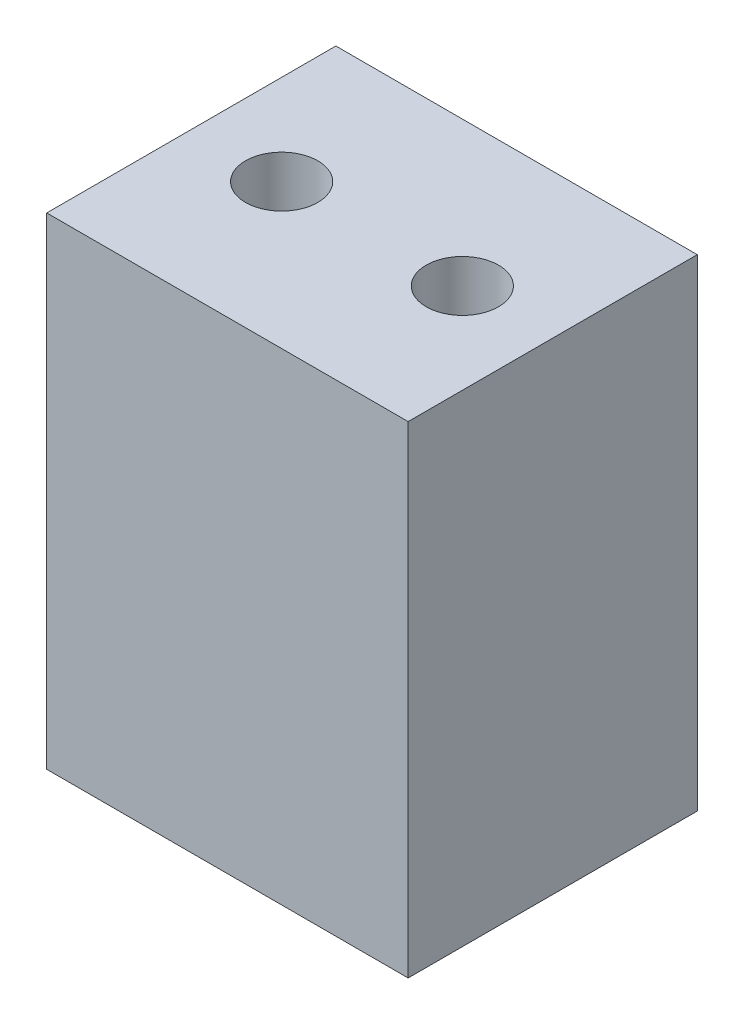
ISO-10303-21;
HEADER;
FILE_DESCRIPTION(('STEP AP214'),'2;1');
FILE_NAME('part.step','',(''),(''),'','','');
FILE_SCHEMA(('AUTOMOTIVE_DESIGN { 1 0 10303 214 1 1 1 1 }'));
ENDSEC;
DATA;
#1=APPLICATION_CONTEXT('core data for automotive mechanical design processes');
#2=APPLICATION_PROTOCOL_DEFINITION('international standard','automotive_design',2000,#1);
#3=PRODUCT_CONTEXT('',#1,'mechanical');
#4=PRODUCT('Part','Part','',(#3));
#5=PRODUCT_RELATED_PRODUCT_CATEGORY('part','',(#4));
#6=PRODUCT_DEFINITION_FORMATION('','',#4);
#7=PRODUCT_DEFINITION_CONTEXT('part definition',#1,'design');
#8=PRODUCT_DEFINITION('design','',#6,#7);
#9=PRODUCT_DEFINITION_SHAPE('','',#8);
#10=(LENGTH_UNIT() NAMED_UNIT(*) SI_UNIT(.MILLI.,.METRE.));
#11=(NAMED_UNIT(*) PLANE_ANGLE_UNIT() SI_UNIT($,.RADIAN.));
#12=(NAMED_UNIT(*) SI_UNIT($,.STERADIAN.) SOLID_ANGLE_UNIT());
#13=UNCERTAINTY_MEASURE_WITH_UNIT(LENGTH_MEASURE(1.E-05),#10,'distance_accuracy_value','');
#14=(GEOMETRIC_REPRESENTATION_CONTEXT(3) GLOBAL_UNCERTAINTY_ASSIGNED_CONTEXT((#13)) GLOBAL_UNIT_ASSIGNED_CONTEXT((#10,
#11,#12)) REPRESENTATION_CONTEXT('',''));
#15=CARTESIAN_POINT('',(0.,0.,0.));
#16=DIRECTION('',(0.,0.,1.));
#17=DIRECTION('',(1.,0.,0.));
#18=AXIS2_PLACEMENT_3D('',#15,#16,#17);
#19=CARTESIAN_POINT('',(0.,40.,0.));
#20=DIRECTION('',(1.,0.,0.));
#21=DIRECTION('',(0.,0.,-1.));
#22=AXIS2_PLACEMENT_3D('',#19,#20,#21);
#23=PLANE('',#22);
#24=DIRECTION('',(0.,0.,1.));
#25=VECTOR('',#24,1.);
#26=CARTESIAN_POINT('',(0.,0.,0.));
#27=LINE('',#26,#25);
#28=CARTESIAN_POINT('',(0.,0.,-24.));
#29=VERTEX_POINT('',#28);
#30=CARTESIAN_POINT('',(0.,0.,0.));
#31=VERTEX_POINT('',#30);
#32=EDGE_CURVE('E96',#29,#31,#27,.T.);
#33=ORIENTED_EDGE('',*,*,#32,.T.);
#34=DIRECTION('',(0.,-1.,0.));
#35=VECTOR('',#34,1.);
#36=CARTESIAN_POINT('',(0.,40.,0.));
#37=LINE('',#36,#35);
#38=CARTESIAN_POINT('',(0.,40.,0.));
#39=VERTEX_POINT('',#38);
#40=EDGE_CURVE('E11',#39,#31,#37,.T.);
#41=ORIENTED_EDGE('',*,*,#40,.F.);
#42=DIRECTION('',(0.,0.,1.));
#43=VECTOR('',#42,1.);
#44=CARTESIAN_POINT('',(0.,40.,0.));
#45=LINE('',#44,#43);
#46=CARTESIAN_POINT('',(0.,40.,-24.));
#47=VERTEX_POINT('',#46);
#48=EDGE_CURVE('E84',#47,#39,#45,.T.);
#49=ORIENTED_EDGE('',*,*,#48,.F.);
#50=DIRECTION('',(0.,-1.,0.));
#51=VECTOR('',#50,1.);
#52=CARTESIAN_POINT('',(0.,40.,-24.));
#53=LINE('',#52,#51);
#54=EDGE_CURVE('E92',#47,#29,#53,.T.);
#55=ORIENTED_EDGE('',*,*,#54,.T.);
#56=EDGE_LOOP('',(#33,#41,#49,#55));
#57=FACE_BOUND('',#56,.T.);
#58=ADVANCED_FACE('F33',(#57),#23,.F.);
#59=CARTESIAN_POINT('',(0.,40.,0.));
#60=DIRECTION('',(0.,0.,-1.));
#61=DIRECTION('',(-1.,0.,0.));
#62=AXIS2_PLACEMENT_3D('',#59,#60,#61);
#63=PLANE('',#62);
#64=DIRECTION('',(1.,0.,0.));
#65=VECTOR('',#64,1.);
#66=CARTESIAN_POINT('',(0.,0.,0.));
#67=LINE('',#66,#65);
#68=CARTESIAN_POINT('',(30.,0.,0.));
#69=VERTEX_POINT('',#68);
#70=EDGE_CURVE('E88',#31,#69,#67,.T.);
#71=ORIENTED_EDGE('',*,*,#70,.T.);
#72=DIRECTION('',(0.,-1.,0.));
#73=VECTOR('',#72,1.);
#74=CARTESIAN_POINT('',(30.,40.,0.));
#75=LINE('',#74,#73);
#76=CARTESIAN_POINT('',(30.,40.,0.));
#77=VERTEX_POINT('',#76);
#78=EDGE_CURVE('E41',#77,#69,#75,.T.);
#79=ORIENTED_EDGE('',*,*,#78,.F.);
#80=DIRECTION('',(1.,0.,0.));
#81=VECTOR('',#80,1.);
#82=CARTESIAN_POINT('',(0.,40.,0.));
#83=LINE('',#82,#81);
#84=EDGE_CURVE('E79',#39,#77,#83,.T.);
#85=ORIENTED_EDGE('',*,*,#84,.F.);
#86=ORIENTED_EDGE('',*,*,#40,.T.);
#87=EDGE_LOOP('',(#71,#79,#85,#86));
#88=FACE_BOUND('',#87,.T.);
#89=ADVANCED_FACE('F87',(#88),#63,.F.);
#90=CARTESIAN_POINT('',(30.,40.,0.));
#91=DIRECTION('',(-1.,0.,0.));
#92=DIRECTION('',(0.,0.,1.));
#93=AXIS2_PLACEMENT_3D('',#90,#91,#92);
#94=PLANE('',#93);
#95=DIRECTION('',(0.,0.,-1.));
#96=VECTOR('',#95,1.);
#97=CARTESIAN_POINT('',(30.,0.,0.));
#98=LINE('',#97,#96);
#99=CARTESIAN_POINT('',(30.,0.,-24.));
#100=VERTEX_POINT('',#99);
#101=EDGE_CURVE('E66',#69,#100,#98,.T.);
#102=ORIENTED_EDGE('',*,*,#101,.T.);
#103=DIRECTION('',(0.,-1.,0.));
#104=VECTOR('',#103,1.);
#105=CARTESIAN_POINT('',(30.,40.,-24.));
#106=LINE('',#105,#104);
#107=CARTESIAN_POINT('',(30.,40.,-24.));
#108=VERTEX_POINT('',#107);
#109=EDGE_CURVE('E89',#108,#100,#106,.T.);
#110=ORIENTED_EDGE('',*,*,#109,.F.);
#111=DIRECTION('',(0.,0.,-1.));
#112=VECTOR('',#111,1.);
#113=CARTESIAN_POINT('',(30.,40.,0.));
#114=LINE('',#113,#112);
#115=EDGE_CURVE('E82',#77,#108,#114,.T.);
#116=ORIENTED_EDGE('',*,*,#115,.F.);
#117=ORIENTED_EDGE('',*,*,#78,.T.);
#118=EDGE_LOOP('',(#102,#110,#116,#117));
#119=FACE_BOUND('',#118,.T.);
#120=ADVANCED_FACE('F90',(#119),#94,.F.);
#121=CARTESIAN_POINT('',(0.,40.,-24.));
#122=DIRECTION('',(0.,0.,1.));
#123=DIRECTION('',(1.,0.,0.));
#124=AXIS2_PLACEMENT_3D('',#121,#122,#123);
#125=PLANE('',#124);
#126=DIRECTION('',(-1.,0.,0.));
#127=VECTOR('',#126,1.);
#128=CARTESIAN_POINT('',(0.,0.,-24.));
#129=LINE('',#128,#127);
#130=EDGE_CURVE('E72',#100,#29,#129,.T.);
#131=ORIENTED_EDGE('',*,*,#130,.T.);
#132=ORIENTED_EDGE('',*,*,#54,.F.);
#133=DIRECTION('',(-1.,0.,0.));
#134=VECTOR('',#133,1.);
#135=CARTESIAN_POINT('',(0.,40.,-24.));
#136=LINE('',#135,#134);
#137=EDGE_CURVE('E49',#108,#47,#136,.T.);
#138=ORIENTED_EDGE('',*,*,#137,.F.);
#139=ORIENTED_EDGE('',*,*,#109,.T.);
#140=EDGE_LOOP('',(#131,#132,#138,#139));
#141=FACE_BOUND('',#140,.T.);
#142=ADVANCED_FACE('F104',(#141),#125,.F.);
#143=CARTESIAN_POINT('',(0.,40.,0.));
#144=DIRECTION('',(0.,-1.,0.));
#145=DIRECTION('',(0.,0.,-1.));
#146=AXIS2_PLACEMENT_3D('',#143,#144,#145);
#147=PLANE('',#146);
#148=CARTESIAN_POINT('',(7.5,40.,-12.));
#149=DIRECTION('',(0.,1.,0.));
#150=DIRECTION('',(0.,0.,1.));
#151=AXIS2_PLACEMENT_3D('',#148,#149,#150);
#152=CIRCLE('',#151,3.);
#153=CARTESIAN_POINT('',(7.5,40.,-9.));
#154=VERTEX_POINT('',#153);
#155=EDGE_CURVE('E116',#154,#154,#152,.T.);
#156=ORIENTED_EDGE('',*,*,#155,.F.);
#157=EDGE_LOOP('',(#156));
#158=FACE_BOUND('',#157,.T.);
#159=CARTESIAN_POINT('',(22.5,40.,-12.));
#160=DIRECTION('',(0.,1.,0.));
#161=DIRECTION('',(0.,0.,1.));
#162=AXIS2_PLACEMENT_3D('',#159,#160,#161);
#163=CIRCLE('',#162,3.);
#164=CARTESIAN_POINT('',(22.5,40.,-9.));
#165=VERTEX_POINT('',#164);
#166=EDGE_CURVE('E110',#165,#165,#163,.T.);
#167=ORIENTED_EDGE('',*,*,#166,.F.);
#168=EDGE_LOOP('',(#167));
#169=FACE_BOUND('',#168,.T.);
#170=ORIENTED_EDGE('',*,*,#48,.T.);
#171=ORIENTED_EDGE('',*,*,#84,.T.);
#172=ORIENTED_EDGE('',*,*,#115,.T.);
#173=ORIENTED_EDGE('',*,*,#137,.T.);
#174=EDGE_LOOP('',(#170,#171,#172,#173));
#175=FACE_BOUND('',#174,.T.);
#176=ADVANCED_FACE('F80',(#158,#169,#175),#147,.F.);
#177=CARTESIAN_POINT('',(0.,0.,0.));
#178=DIRECTION('',(0.,-1.,0.));
#179=DIRECTION('',(0.,0.,-1.));
#180=AXIS2_PLACEMENT_3D('',#177,#178,#179);
#181=PLANE('',#180);
#182=CARTESIAN_POINT('',(7.5,0.,-12.));
#183=DIRECTION('',(0.,1.,0.));
#184=DIRECTION('',(0.,0.,1.));
#185=AXIS2_PLACEMENT_3D('',#182,#183,#184);
#186=CIRCLE('',#185,3.);
#187=CARTESIAN_POINT('',(7.5,0.,-9.));
#188=VERTEX_POINT('',#187);
#189=EDGE_CURVE('E99',#188,#188,#186,.T.);
#190=ORIENTED_EDGE('',*,*,#189,.T.);
#191=EDGE_LOOP('',(#190));
#192=FACE_BOUND('',#191,.T.);
#193=CARTESIAN_POINT('',(22.5,0.,-12.));
#194=DIRECTION('',(0.,1.,0.));
#195=DIRECTION('',(0.,0.,1.));
#196=AXIS2_PLACEMENT_3D('',#193,#194,#195);
#197=CIRCLE('',#196,3.);
#198=CARTESIAN_POINT('',(22.5,0.,-9.));
#199=VERTEX_POINT('',#198);
#200=EDGE_CURVE('E113',#199,#199,#197,.T.);
#201=ORIENTED_EDGE('',*,*,#200,.T.);
#202=EDGE_LOOP('',(#201));
#203=FACE_BOUND('',#202,.T.);
#204=ORIENTED_EDGE('',*,*,#32,.F.);
#205=ORIENTED_EDGE('',*,*,#130,.F.);
#206=ORIENTED_EDGE('',*,*,#101,.F.);
#207=ORIENTED_EDGE('',*,*,#70,.F.);
#208=EDGE_LOOP('',(#204,#205,#206,#207));
#209=FACE_BOUND('',#208,.T.);
#210=ADVANCED_FACE('F107',(#192,#203,#209),#181,.T.);
#211=CARTESIAN_POINT('',(22.5,0.,-12.));
#212=DIRECTION('',(0.,1.,0.));
#213=DIRECTION('',(0.,0.,1.));
#214=AXIS2_PLACEMENT_3D('',#211,#212,#213);
#215=CYLINDRICAL_SURFACE('',#214,3.);
#216=ORIENTED_EDGE('',*,*,#200,.F.);
#217=EDGE_LOOP('',(#216));
#218=FACE_BOUND('',#217,.T.);
#219=ORIENTED_EDGE('',*,*,#166,.T.);
#220=EDGE_LOOP('',(#219));
#221=FACE_BOUND('',#220,.T.);
#222=ADVANCED_FACE('F127',(#218,#221),#215,.F.);
#223=CARTESIAN_POINT('',(7.5,0.,-12.));
#224=DIRECTION('',(0.,1.,0.));
#225=DIRECTION('',(0.,0.,1.));
#226=AXIS2_PLACEMENT_3D('',#223,#224,#225);
#227=CYLINDRICAL_SURFACE('',#226,3.);
#228=ORIENTED_EDGE('',*,*,#189,.F.);
#229=EDGE_LOOP('',(#228));
#230=FACE_BOUND('',#229,.T.);
#231=ORIENTED_EDGE('',*,*,#155,.T.);
#232=EDGE_LOOP('',(#231));
#233=FACE_BOUND('',#232,.T.);
#234=ADVANCED_FACE('F124',(#230,#233),#227,.F.);
#235=CLOSED_SHELL('',(#58,#89,#120,#142,#176,#210,#222,#234));
#236=MANIFOLD_SOLID_BREP('B2',#235);
#237=ADVANCED_BREP_SHAPE_REPRESENTATION('',(#18,#236),#14);
#238=SHAPE_DEFINITION_REPRESENTATION(#9,#237);
ENDSEC;
END-ISO-10303-21;
